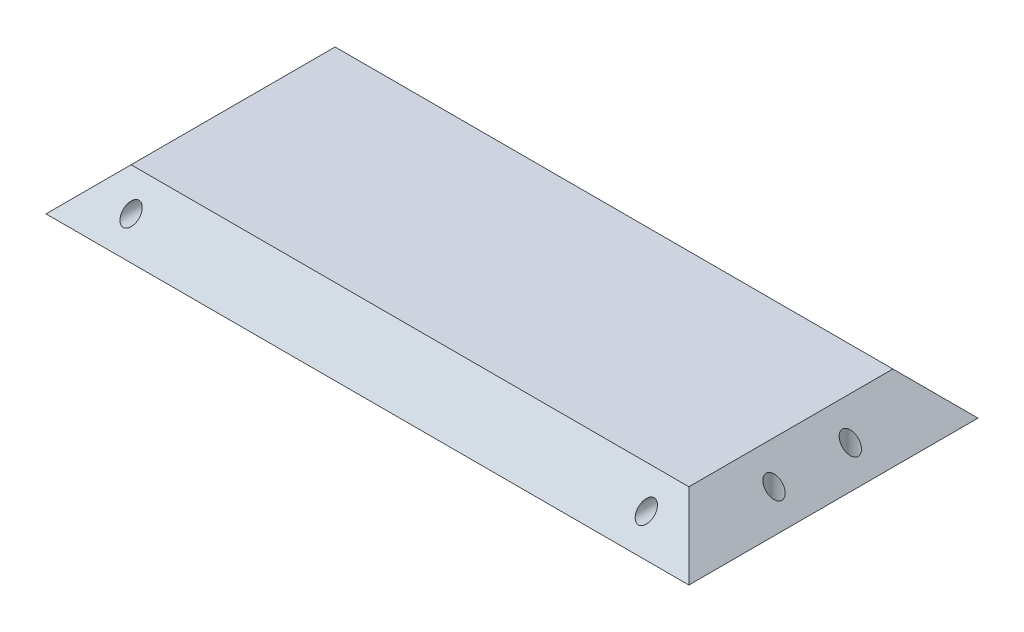
ISO-10303-21;
HEADER;
FILE_DESCRIPTION(('STEP AP214'),'2;1');
FILE_NAME('part.step','',(''),(''),'','','');
FILE_SCHEMA(('AUTOMOTIVE_DESIGN { 1 0 10303 214 1 1 1 1 }'));
ENDSEC;
DATA;
#1=APPLICATION_CONTEXT('core data for automotive mechanical design processes');
#2=APPLICATION_PROTOCOL_DEFINITION('international standard','automotive_design',2000,#1);
#3=PRODUCT_CONTEXT('',#1,'mechanical');
#4=PRODUCT('Part','Part','',(#3));
#5=PRODUCT_RELATED_PRODUCT_CATEGORY('part','',(#4));
#6=PRODUCT_DEFINITION_FORMATION('','',#4);
#7=PRODUCT_DEFINITION_CONTEXT('part definition',#1,'design');
#8=PRODUCT_DEFINITION('design','',#6,#7);
#9=PRODUCT_DEFINITION_SHAPE('','',#8);
#10=(LENGTH_UNIT() NAMED_UNIT(*) SI_UNIT(.MILLI.,.METRE.));
#11=(NAMED_UNIT(*) PLANE_ANGLE_UNIT() SI_UNIT($,.RADIAN.));
#12=(NAMED_UNIT(*) SI_UNIT($,.STERADIAN.) SOLID_ANGLE_UNIT());
#13=UNCERTAINTY_MEASURE_WITH_UNIT(LENGTH_MEASURE(1.E-05),#10,'distance_accuracy_value','');
#14=(GEOMETRIC_REPRESENTATION_CONTEXT(3) GLOBAL_UNCERTAINTY_ASSIGNED_CONTEXT((#13)) GLOBAL_UNIT_ASSIGNED_CONTEXT((#10,
#11,#12)) REPRESENTATION_CONTEXT('',''));
#15=CARTESIAN_POINT('',(0.,0.,0.));
#16=DIRECTION('',(0.,0.,1.));
#17=DIRECTION('',(1.,0.,0.));
#18=AXIS2_PLACEMENT_3D('',#15,#16,#17);
#19=CARTESIAN_POINT('',(0.,0.,0.));
#20=DIRECTION('',(0.,-1.,0.));
#21=DIRECTION('',(0.,0.,-1.));
#22=AXIS2_PLACEMENT_3D('',#19,#20,#21);
#23=PLANE('',#22);
#24=CARTESIAN_POINT('',(-70.5295942854501,0.,-8.96631626945786));
#25=DIRECTION('',(0.,1.,0.));
#26=DIRECTION('',(0.,0.,1.));
#27=AXIS2_PLACEMENT_3D('',#24,#25,#26);
#28=CIRCLE('',#27,1.85);
#29=CARTESIAN_POINT('',(-70.5295942854501,0.,-7.11631626945785));
#30=VERTEX_POINT('',#29);
#31=EDGE_CURVE('E349',#30,#30,#28,.T.);
#32=ORIENTED_EDGE('',*,*,#31,.T.);
#33=EDGE_LOOP('',(#32));
#34=FACE_BOUND('',#33,.T.);
#35=CARTESIAN_POINT('',(-70.5295942854501,0.,8.96631626945786));
#36=DIRECTION('',(0.,-1.,0.));
#37=DIRECTION('',(0.,0.,-1.));
#38=AXIS2_PLACEMENT_3D('',#35,#36,#37);
#39=CIRCLE('',#38,1.85);
#40=CARTESIAN_POINT('',(-70.5295942854501,0.,7.11631626945785));
#41=VERTEX_POINT('',#40);
#42=EDGE_CURVE('E353',#41,#41,#39,.T.);
#43=ORIENTED_EDGE('',*,*,#42,.F.);
#44=EDGE_LOOP('',(#43));
#45=FACE_BOUND('',#44,.T.);
#46=CARTESIAN_POINT('',(70.5295942854501,0.,-8.96631626945786));
#47=DIRECTION('',(0.,-1.,0.));
#48=DIRECTION('',(0.,0.,-1.));
#49=AXIS2_PLACEMENT_3D('',#46,#47,#48);
#50=CIRCLE('',#49,1.85);
#51=CARTESIAN_POINT('',(70.5295942854501,0.,-10.8163162694579));
#52=VERTEX_POINT('',#51);
#53=EDGE_CURVE('E259',#52,#52,#50,.T.);
#54=ORIENTED_EDGE('',*,*,#53,.F.);
#55=EDGE_LOOP('',(#54));
#56=FACE_BOUND('',#55,.T.);
#57=DIRECTION('',(0.,0.,-1.));
#58=VECTOR('',#57,1.);
#59=CARTESIAN_POINT('',(75.5295942854501,0.,33.9663162694579));
#60=LINE('',#59,#58);
#61=CARTESIAN_POINT('',(75.5295942854501,0.,33.9663162694579));
#62=VERTEX_POINT('',#61);
#63=CARTESIAN_POINT('',(75.5295942854501,0.,-33.9663162694579));
#64=VERTEX_POINT('',#63);
#65=EDGE_CURVE('E111',#62,#64,#60,.T.);
#66=ORIENTED_EDGE('',*,*,#65,.F.);
#67=DIRECTION('',(1.,0.,0.));
#68=VECTOR('',#67,1.);
#69=CARTESIAN_POINT('',(-75.5295942854501,0.,33.9663162694579));
#70=LINE('',#69,#68);
#71=CARTESIAN_POINT('',(-75.5295942854501,0.,33.9663162694579));
#72=VERTEX_POINT('',#71);
#73=EDGE_CURVE('E97',#72,#62,#70,.T.);
#74=ORIENTED_EDGE('',*,*,#73,.F.);
#75=DIRECTION('',(0.,0.,1.));
#76=VECTOR('',#75,1.);
#77=CARTESIAN_POINT('',(-75.5295942854501,0.,33.9663162694579));
#78=LINE('',#77,#76);
#79=CARTESIAN_POINT('',(-75.5295942854501,0.,-33.9663162694579));
#80=VERTEX_POINT('',#79);
#81=EDGE_CURVE('E89',#80,#72,#78,.T.);
#82=ORIENTED_EDGE('',*,*,#81,.F.);
#83=DIRECTION('',(-1.,0.,0.));
#84=VECTOR('',#83,1.);
#85=CARTESIAN_POINT('',(-75.5295942854501,0.,-33.9663162694579));
#86=LINE('',#85,#84);
#87=EDGE_CURVE('E93',#64,#80,#86,.T.);
#88=ORIENTED_EDGE('',*,*,#87,.F.);
#89=EDGE_LOOP('',(#66,#74,#82,#88));
#90=FACE_BOUND('',#89,.T.);
#91=CARTESIAN_POINT('',(70.5295942854501,0.,8.96631626945786));
#92=DIRECTION('',(0.,1.,0.));
#93=DIRECTION('',(0.,0.,1.));
#94=AXIS2_PLACEMENT_3D('',#91,#92,#93);
#95=CIRCLE('',#94,1.85);
#96=CARTESIAN_POINT('',(70.5295942854501,0.,10.8163162694579));
#97=VERTEX_POINT('',#96);
#98=EDGE_CURVE('E357',#97,#97,#95,.T.);
#99=ORIENTED_EDGE('',*,*,#98,.T.);
#100=EDGE_LOOP('',(#99));
#101=FACE_BOUND('',#100,.T.);
#102=ADVANCED_FACE('F45',(#34,#45,#56,#90,#101),#23,.T.);
#103=CARTESIAN_POINT('',(-37.7647971427251,37.7647971427251,0.));
#104=DIRECTION('',(0.707106781186548,-0.707106781186547,0.));
#105=DIRECTION('',(0.707106781186547,0.707106781186548,0.));
#106=AXIS2_PLACEMENT_3D('',#103,#104,#105);
#107=PLANE('',#106);
#108=CARTESIAN_POINT('',(-70.5295942854501,5.00000000000002,8.96631626945786));
#109=DIRECTION('',(0.707106781186548,-0.707106781186547,0.));
#110=DIRECTION('',(-0.707106781186547,-0.707106781186548,0.));
#111=AXIS2_PLACEMENT_3D('',#108,#109,#110);
#112=ELLIPSE('',#111,2.61629509039023,1.85);
#113=CARTESIAN_POINT('',(-72.3795942854501,3.15000000000002,8.96631626945786));
#114=VERTEX_POINT('',#113);
#115=EDGE_CURVE('E261',#114,#114,#112,.T.);
#116=ORIENTED_EDGE('',*,*,#115,.T.);
#117=EDGE_LOOP('',(#116));
#118=FACE_BOUND('',#117,.T.);
#119=DIRECTION('',(0.577350269189626,0.577350269189626,-0.577350269189626));
#120=VECTOR('',#119,1.);
#121=CARTESIAN_POINT('',(-75.5295942854501,0.,33.9663162694579));
#122=LINE('',#121,#120);
#123=CARTESIAN_POINT('',(-65.5295942854501,10.,23.9663162694579));
#124=VERTEX_POINT('',#123);
#125=EDGE_CURVE('E119',#72,#124,#122,.T.);
#126=ORIENTED_EDGE('',*,*,#125,.T.);
#127=DIRECTION('',(0.,0.,1.));
#128=VECTOR('',#127,1.);
#129=CARTESIAN_POINT('',(-65.5295942854501,10.,-23.9663162694579));
#130=LINE('',#129,#128);
#131=CARTESIAN_POINT('',(-65.5295942854501,10.,-23.9663162694579));
#132=VERTEX_POINT('',#131);
#133=EDGE_CURVE('E12',#132,#124,#130,.T.);
#134=ORIENTED_EDGE('',*,*,#133,.F.);
#135=DIRECTION('',(0.577350269189626,0.577350269189626,0.577350269189626));
#136=VECTOR('',#135,1.);
#137=CARTESIAN_POINT('',(-75.5295942854501,0.,-33.9663162694579));
#138=LINE('',#137,#136);
#139=EDGE_CURVE('E70',#80,#132,#138,.T.);
#140=ORIENTED_EDGE('',*,*,#139,.F.);
#141=ORIENTED_EDGE('',*,*,#81,.T.);
#142=EDGE_LOOP('',(#126,#134,#140,#141));
#143=FACE_BOUND('',#142,.T.);
#144=CARTESIAN_POINT('',(-70.5295942854501,5.00000000000002,-8.96631626945786));
#145=DIRECTION('',(0.707106781186548,-0.707106781186547,0.));
#146=DIRECTION('',(-0.707106781186547,-0.707106781186548,0.));
#147=AXIS2_PLACEMENT_3D('',#144,#145,#146);
#148=ELLIPSE('',#147,2.61629509039023,1.85);
#149=CARTESIAN_POINT('',(-72.3795942854501,3.15000000000002,-8.96631626945786));
#150=VERTEX_POINT('',#149);
#151=EDGE_CURVE('E50',#150,#150,#148,.F.);
#152=ORIENTED_EDGE('',*,*,#151,.F.);
#153=EDGE_LOOP('',(#152));
#154=FACE_BOUND('',#153,.T.);
#155=ADVANCED_FACE('F115',(#118,#143,#154),#107,.F.);
#156=CARTESIAN_POINT('',(37.7647971427251,37.7647971427251,0.));
#157=DIRECTION('',(-0.707106781186548,-0.707106781186547,0.));
#158=DIRECTION('',(0.707106781186547,-0.707106781186548,0.));
#159=AXIS2_PLACEMENT_3D('',#156,#157,#158);
#160=PLANE('',#159);
#161=CARTESIAN_POINT('',(70.5295942854501,5.00000000000002,-8.96631626945786));
#162=DIRECTION('',(-0.707106781186548,-0.707106781186547,0.));
#163=DIRECTION('',(0.707106781186547,-0.707106781186548,0.));
#164=AXIS2_PLACEMENT_3D('',#161,#162,#163);
#165=ELLIPSE('',#164,2.61629509039023,1.85);
#166=CARTESIAN_POINT('',(72.3795942854501,3.15000000000002,-8.96631626945786));
#167=VERTEX_POINT('',#166);
#168=EDGE_CURVE('E255',#167,#167,#165,.T.);
#169=ORIENTED_EDGE('',*,*,#168,.T.);
#170=EDGE_LOOP('',(#169));
#171=FACE_BOUND('',#170,.T.);
#172=DIRECTION('',(-0.577350269189626,0.577350269189626,0.577350269189626));
#173=VECTOR('',#172,1.);
#174=CARTESIAN_POINT('',(75.5295942854501,0.,-33.9663162694579));
#175=LINE('',#174,#173);
#176=CARTESIAN_POINT('',(65.5295942854501,10.,-23.9663162694578));
#177=VERTEX_POINT('',#176);
#178=EDGE_CURVE('E110',#64,#177,#175,.T.);
#179=ORIENTED_EDGE('',*,*,#178,.T.);
#180=DIRECTION('',(0.,0.,-1.));
#181=VECTOR('',#180,1.);
#182=CARTESIAN_POINT('',(65.5295942854501,10.,23.9663162694579));
#183=LINE('',#182,#181);
#184=CARTESIAN_POINT('',(65.5295942854501,10.,23.9663162694579));
#185=VERTEX_POINT('',#184);
#186=EDGE_CURVE('E203',#185,#177,#183,.T.);
#187=ORIENTED_EDGE('',*,*,#186,.F.);
#188=DIRECTION('',(-0.577350269189626,0.577350269189626,-0.577350269189626));
#189=VECTOR('',#188,1.);
#190=CARTESIAN_POINT('',(75.5295942854501,0.,33.9663162694579));
#191=LINE('',#190,#189);
#192=EDGE_CURVE('E118',#62,#185,#191,.T.);
#193=ORIENTED_EDGE('',*,*,#192,.F.);
#194=ORIENTED_EDGE('',*,*,#65,.T.);
#195=EDGE_LOOP('',(#179,#187,#193,#194));
#196=FACE_BOUND('',#195,.T.);
#197=CARTESIAN_POINT('',(70.5295942854501,5.00000000000002,8.96631626945786));
#198=DIRECTION('',(-0.707106781186548,-0.707106781186547,0.));
#199=DIRECTION('',(0.707106781186547,-0.707106781186548,0.));
#200=AXIS2_PLACEMENT_3D('',#197,#198,#199);
#201=ELLIPSE('',#200,2.61629509039023,1.85);
#202=CARTESIAN_POINT('',(72.3795942854501,3.15000000000002,8.96631626945786));
#203=VERTEX_POINT('',#202);
#204=EDGE_CURVE('E258',#203,#203,#201,.F.);
#205=ORIENTED_EDGE('',*,*,#204,.F.);
#206=EDGE_LOOP('',(#205));
#207=FACE_BOUND('',#206,.T.);
#208=ADVANCED_FACE('F142',(#171,#196,#207),#160,.F.);
#209=CARTESIAN_POINT('',(0.,10.,0.));
#210=DIRECTION('',(0.,1.,0.));
#211=DIRECTION('',(0.,0.,1.));
#212=AXIS2_PLACEMENT_3D('',#209,#210,#211);
#213=PLANE('',#212);
#214=DIRECTION('',(1.,0.,0.));
#215=VECTOR('',#214,1.);
#216=CARTESIAN_POINT('',(-65.5295942854501,10.,23.9663162694579));
#217=LINE('',#216,#215);
#218=EDGE_CURVE('E159',#124,#185,#217,.T.);
#219=ORIENTED_EDGE('',*,*,#218,.T.);
#220=ORIENTED_EDGE('',*,*,#186,.T.);
#221=DIRECTION('',(-1.,0.,0.));
#222=VECTOR('',#221,1.);
#223=CARTESIAN_POINT('',(65.5295942854501,10.,-23.9663162694579));
#224=LINE('',#223,#222);
#225=EDGE_CURVE('E55',#177,#132,#224,.T.);
#226=ORIENTED_EDGE('',*,*,#225,.T.);
#227=ORIENTED_EDGE('',*,*,#133,.T.);
#228=EDGE_LOOP('',(#219,#220,#226,#227));
#229=FACE_BOUND('',#228,.T.);
#230=ADVANCED_FACE('F47',(#229),#213,.T.);
#231=CARTESIAN_POINT('',(0.,16.9831581347289,-16.9831581347289));
#232=DIRECTION('',(0.,-0.707106781186548,0.707106781186548));
#233=DIRECTION('',(0.,-0.707106781186548,-0.707106781186548));
#234=AXIS2_PLACEMENT_3D('',#231,#232,#233);
#235=PLANE('',#234);
#236=CARTESIAN_POINT('',(-60.5295942854501,5.,-28.9663162694579));
#237=DIRECTION('',(0.,-0.707106781186548,0.707106781186548));
#238=DIRECTION('',(0.,-0.707106781186548,-0.707106781186548));
#239=AXIS2_PLACEMENT_3D('',#236,#237,#238);
#240=ELLIPSE('',#239,2.61629509039022,1.85);
#241=CARTESIAN_POINT('',(-60.5295942854501,3.15,-30.8163162694579));
#242=VERTEX_POINT('',#241);
#243=EDGE_CURVE('E250',#242,#242,#240,.F.);
#244=ORIENTED_EDGE('',*,*,#243,.F.);
#245=EDGE_LOOP('',(#244));
#246=FACE_BOUND('',#245,.T.);
#247=CARTESIAN_POINT('',(60.5295942854501,5.,-28.9663162694579));
#248=DIRECTION('',(0.,-0.707106781186548,0.707106781186548));
#249=DIRECTION('',(0.,-0.707106781186548,-0.707106781186548));
#250=AXIS2_PLACEMENT_3D('',#247,#248,#249);
#251=ELLIPSE('',#250,2.61629509039022,1.85);
#252=CARTESIAN_POINT('',(60.5295942854501,3.15,-30.8163162694579));
#253=VERTEX_POINT('',#252);
#254=EDGE_CURVE('E247',#253,#253,#251,.F.);
#255=ORIENTED_EDGE('',*,*,#254,.F.);
#256=EDGE_LOOP('',(#255));
#257=FACE_BOUND('',#256,.T.);
#258=ORIENTED_EDGE('',*,*,#139,.T.);
#259=ORIENTED_EDGE('',*,*,#225,.F.);
#260=ORIENTED_EDGE('',*,*,#178,.F.);
#261=ORIENTED_EDGE('',*,*,#87,.T.);
#262=EDGE_LOOP('',(#258,#259,#260,#261));
#263=FACE_BOUND('',#262,.T.);
#264=ADVANCED_FACE('F108',(#246,#257,#263),#235,.F.);
#265=CARTESIAN_POINT('',(0.,16.9831581347289,16.9831581347289));
#266=DIRECTION('',(0.,-0.707106781186548,-0.707106781186548));
#267=DIRECTION('',(0.,0.707106781186548,-0.707106781186548));
#268=AXIS2_PLACEMENT_3D('',#265,#266,#267);
#269=PLANE('',#268);
#270=CARTESIAN_POINT('',(-60.5295942854501,5.,28.9663162694579));
#271=DIRECTION('',(0.,-0.707106781186548,-0.707106781186548));
#272=DIRECTION('',(0.,-0.707106781186548,0.707106781186548));
#273=AXIS2_PLACEMENT_3D('',#270,#271,#272);
#274=ELLIPSE('',#273,2.61629509039022,1.85);
#275=CARTESIAN_POINT('',(-60.5295942854501,3.15,30.8163162694579));
#276=VERTEX_POINT('',#275);
#277=EDGE_CURVE('E243',#276,#276,#274,.T.);
#278=ORIENTED_EDGE('',*,*,#277,.T.);
#279=EDGE_LOOP('',(#278));
#280=FACE_BOUND('',#279,.T.);
#281=CARTESIAN_POINT('',(60.5295942854501,5.,28.9663162694579));
#282=DIRECTION('',(0.,-0.707106781186548,-0.707106781186548));
#283=DIRECTION('',(0.,-0.707106781186548,0.707106781186548));
#284=AXIS2_PLACEMENT_3D('',#281,#282,#283);
#285=ELLIPSE('',#284,2.61629509039022,1.85);
#286=CARTESIAN_POINT('',(60.5295942854501,3.15,30.8163162694579));
#287=VERTEX_POINT('',#286);
#288=EDGE_CURVE('E235',#287,#287,#285,.T.);
#289=ORIENTED_EDGE('',*,*,#288,.T.);
#290=EDGE_LOOP('',(#289));
#291=FACE_BOUND('',#290,.T.);
#292=ORIENTED_EDGE('',*,*,#192,.T.);
#293=ORIENTED_EDGE('',*,*,#218,.F.);
#294=ORIENTED_EDGE('',*,*,#125,.F.);
#295=ORIENTED_EDGE('',*,*,#73,.T.);
#296=EDGE_LOOP('',(#292,#293,#294,#295));
#297=FACE_BOUND('',#296,.T.);
#298=ADVANCED_FACE('F164',(#280,#291,#297),#269,.F.);
#299=CARTESIAN_POINT('',(60.5295942854501,5.,13.9663162694579));
#300=DIRECTION('',(0.,0.,1.));
#301=DIRECTION('',(1.,0.,0.));
#302=AXIS2_PLACEMENT_3D('',#299,#300,#301);
#303=CYLINDRICAL_SURFACE('',#302,1.85);
#304=CARTESIAN_POINT('',(60.5295942854501,5.,13.9663162694579));
#305=DIRECTION('',(0.,0.,1.));
#306=DIRECTION('',(-1.,0.,0.));
#307=AXIS2_PLACEMENT_3D('',#304,#305,#306);
#308=CIRCLE('',#307,1.85);
#309=CARTESIAN_POINT('',(58.6795942854501,5.,13.9663162694579));
#310=VERTEX_POINT('',#309);
#311=EDGE_CURVE('E254',#310,#310,#308,.T.);
#312=ORIENTED_EDGE('',*,*,#311,.F.);
#313=EDGE_LOOP('',(#312));
#314=FACE_BOUND('',#313,.T.);
#315=ORIENTED_EDGE('',*,*,#288,.F.);
#316=EDGE_LOOP('',(#315));
#317=FACE_BOUND('',#316,.T.);
#318=ADVANCED_FACE('F172',(#314,#317),#303,.F.);
#319=CARTESIAN_POINT('',(60.5295942854501,5.,13.9663162694579));
#320=DIRECTION('',(0.,0.,-1.));
#321=DIRECTION('',(-1.,0.,0.));
#322=AXIS2_PLACEMENT_3D('',#319,#320,#321);
#323=PLANE('',#322);
#324=ORIENTED_EDGE('',*,*,#311,.T.);
#325=EDGE_LOOP('',(#324));
#326=FACE_BOUND('',#325,.T.);
#327=ADVANCED_FACE('F280',(#326),#323,.F.);
#328=CARTESIAN_POINT('',(-60.5295942854501,5.,13.9663162694579));
#329=DIRECTION('',(0.,0.,1.));
#330=DIRECTION('',(1.,0.,0.));
#331=AXIS2_PLACEMENT_3D('',#328,#329,#330);
#332=CYLINDRICAL_SURFACE('',#331,1.85);
#333=CARTESIAN_POINT('',(-60.5295942854501,5.,13.9663162694579));
#334=DIRECTION('',(0.,0.,1.));
#335=DIRECTION('',(1.,0.,0.));
#336=AXIS2_PLACEMENT_3D('',#333,#334,#335);
#337=CIRCLE('',#336,1.85);
#338=CARTESIAN_POINT('',(-58.6795942854501,5.,13.9663162694579));
#339=VERTEX_POINT('',#338);
#340=EDGE_CURVE('E244',#339,#339,#337,.T.);
#341=ORIENTED_EDGE('',*,*,#340,.F.);
#342=EDGE_LOOP('',(#341));
#343=FACE_BOUND('',#342,.T.);
#344=ORIENTED_EDGE('',*,*,#277,.F.);
#345=EDGE_LOOP('',(#344));
#346=FACE_BOUND('',#345,.T.);
#347=ADVANCED_FACE('F399',(#343,#346),#332,.F.);
#348=CARTESIAN_POINT('',(-60.5295942854501,5.,13.9663162694579));
#349=DIRECTION('',(0.,0.,1.));
#350=DIRECTION('',(1.,0.,0.));
#351=AXIS2_PLACEMENT_3D('',#348,#349,#350);
#352=PLANE('',#351);
#353=ORIENTED_EDGE('',*,*,#340,.T.);
#354=EDGE_LOOP('',(#353));
#355=FACE_BOUND('',#354,.T.);
#356=ADVANCED_FACE('F396',(#355),#352,.T.);
#357=CARTESIAN_POINT('',(60.5295942854501,5.,-13.9663162694579));
#358=DIRECTION('',(0.,0.,-1.));
#359=DIRECTION('',(-1.,0.,0.));
#360=AXIS2_PLACEMENT_3D('',#357,#358,#359);
#361=CYLINDRICAL_SURFACE('',#360,1.85);
#362=CARTESIAN_POINT('',(60.5295942854501,5.,-13.9663162694579));
#363=DIRECTION('',(0.,0.,1.));
#364=DIRECTION('',(-1.,0.,0.));
#365=AXIS2_PLACEMENT_3D('',#362,#363,#364);
#366=CIRCLE('',#365,1.85);
#367=CARTESIAN_POINT('',(58.6795942854501,5.,-13.9663162694579));
#368=VERTEX_POINT('',#367);
#369=EDGE_CURVE('E265',#368,#368,#366,.T.);
#370=ORIENTED_EDGE('',*,*,#369,.T.);
#371=EDGE_LOOP('',(#370));
#372=FACE_BOUND('',#371,.T.);
#373=ORIENTED_EDGE('',*,*,#254,.T.);
#374=EDGE_LOOP('',(#373));
#375=FACE_BOUND('',#374,.T.);
#376=ADVANCED_FACE('F392',(#372,#375),#361,.F.);
#377=CARTESIAN_POINT('',(60.5295942854501,5.,-13.9663162694579));
#378=DIRECTION('',(0.,0.,1.));
#379=DIRECTION('',(-1.,0.,0.));
#380=AXIS2_PLACEMENT_3D('',#377,#378,#379);
#381=PLANE('',#380);
#382=ORIENTED_EDGE('',*,*,#369,.F.);
#383=EDGE_LOOP('',(#382));
#384=FACE_BOUND('',#383,.T.);
#385=ADVANCED_FACE('F388',(#384),#381,.F.);
#386=CARTESIAN_POINT('',(-60.5295942854501,5.,-13.9663162694579));
#387=DIRECTION('',(0.,0.,-1.));
#388=DIRECTION('',(-1.,0.,0.));
#389=AXIS2_PLACEMENT_3D('',#386,#387,#388);
#390=CYLINDRICAL_SURFACE('',#389,1.85);
#391=CARTESIAN_POINT('',(-60.5295942854501,5.,-13.9663162694579));
#392=DIRECTION('',(0.,0.,1.));
#393=DIRECTION('',(1.,0.,0.));
#394=AXIS2_PLACEMENT_3D('',#391,#392,#393);
#395=CIRCLE('',#394,1.85);
#396=CARTESIAN_POINT('',(-58.6795942854501,5.,-13.9663162694579));
#397=VERTEX_POINT('',#396);
#398=EDGE_CURVE('E251',#397,#397,#395,.T.);
#399=ORIENTED_EDGE('',*,*,#398,.T.);
#400=EDGE_LOOP('',(#399));
#401=FACE_BOUND('',#400,.T.);
#402=ORIENTED_EDGE('',*,*,#243,.T.);
#403=EDGE_LOOP('',(#402));
#404=FACE_BOUND('',#403,.T.);
#405=ADVANCED_FACE('F384',(#401,#404),#390,.F.);
#406=CARTESIAN_POINT('',(-60.5295942854501,5.,-13.9663162694579));
#407=DIRECTION('',(0.,0.,-1.));
#408=DIRECTION('',(1.,0.,0.));
#409=AXIS2_PLACEMENT_3D('',#406,#407,#408);
#410=PLANE('',#409);
#411=ORIENTED_EDGE('',*,*,#398,.F.);
#412=EDGE_LOOP('',(#411));
#413=FACE_BOUND('',#412,.T.);
#414=ADVANCED_FACE('F381',(#413),#410,.T.);
#415=CARTESIAN_POINT('',(70.5295942854501,10.0001,-8.96631626945786));
#416=DIRECTION('',(0.,-1.,0.));
#417=DIRECTION('',(0.,0.,-1.));
#418=AXIS2_PLACEMENT_3D('',#415,#416,#417);
#419=CYLINDRICAL_SURFACE('',#418,1.85);
#420=ORIENTED_EDGE('',*,*,#53,.T.);
#421=EDGE_LOOP('',(#420));
#422=FACE_BOUND('',#421,.T.);
#423=ORIENTED_EDGE('',*,*,#168,.F.);
#424=EDGE_LOOP('',(#423));
#425=FACE_BOUND('',#424,.T.);
#426=ADVANCED_FACE('F375',(#422,#425),#419,.F.);
#427=CARTESIAN_POINT('',(70.5295942854501,10.0001,8.96631626945786));
#428=DIRECTION('',(0.,-1.,0.));
#429=DIRECTION('',(0.,0.,-1.));
#430=AXIS2_PLACEMENT_3D('',#427,#428,#429);
#431=CYLINDRICAL_SURFACE('',#430,1.85);
#432=ORIENTED_EDGE('',*,*,#98,.F.);
#433=EDGE_LOOP('',(#432));
#434=FACE_BOUND('',#433,.T.);
#435=ORIENTED_EDGE('',*,*,#204,.T.);
#436=EDGE_LOOP('',(#435));
#437=FACE_BOUND('',#436,.T.);
#438=ADVANCED_FACE('F367',(#434,#437),#431,.F.);
#439=CARTESIAN_POINT('',(-70.5295942854501,10.0001,8.96631626945786));
#440=DIRECTION('',(0.,-1.,0.));
#441=DIRECTION('',(0.,0.,-1.));
#442=AXIS2_PLACEMENT_3D('',#439,#440,#441);
#443=CYLINDRICAL_SURFACE('',#442,1.85);
#444=ORIENTED_EDGE('',*,*,#42,.T.);
#445=EDGE_LOOP('',(#444));
#446=FACE_BOUND('',#445,.T.);
#447=ORIENTED_EDGE('',*,*,#115,.F.);
#448=EDGE_LOOP('',(#447));
#449=FACE_BOUND('',#448,.T.);
#450=ADVANCED_FACE('F363',(#446,#449),#443,.F.);
#451=CARTESIAN_POINT('',(-70.5295942854501,10.0001,-8.96631626945786));
#452=DIRECTION('',(0.,-1.,0.));
#453=DIRECTION('',(0.,0.,-1.));
#454=AXIS2_PLACEMENT_3D('',#451,#452,#453);
#455=CYLINDRICAL_SURFACE('',#454,1.85);
#456=ORIENTED_EDGE('',*,*,#31,.F.);
#457=EDGE_LOOP('',(#456));
#458=FACE_BOUND('',#457,.T.);
#459=ORIENTED_EDGE('',*,*,#151,.T.);
#460=EDGE_LOOP('',(#459));
#461=FACE_BOUND('',#460,.T.);
#462=ADVANCED_FACE('F366',(#458,#461),#455,.F.);
#463=CLOSED_SHELL('',(#102,#155,#208,#230,#264,#298,#318,#327,#347,#356,#376,#385,#405,#414,
#426,#438,#450,#462));
#464=MANIFOLD_SOLID_BREP('B2',#463);
#465=ADVANCED_BREP_SHAPE_REPRESENTATION('',(#18,#464),#14);
#466=SHAPE_DEFINITION_REPRESENTATION(#9,#465);
ENDSEC;
END-ISO-10303-21;
